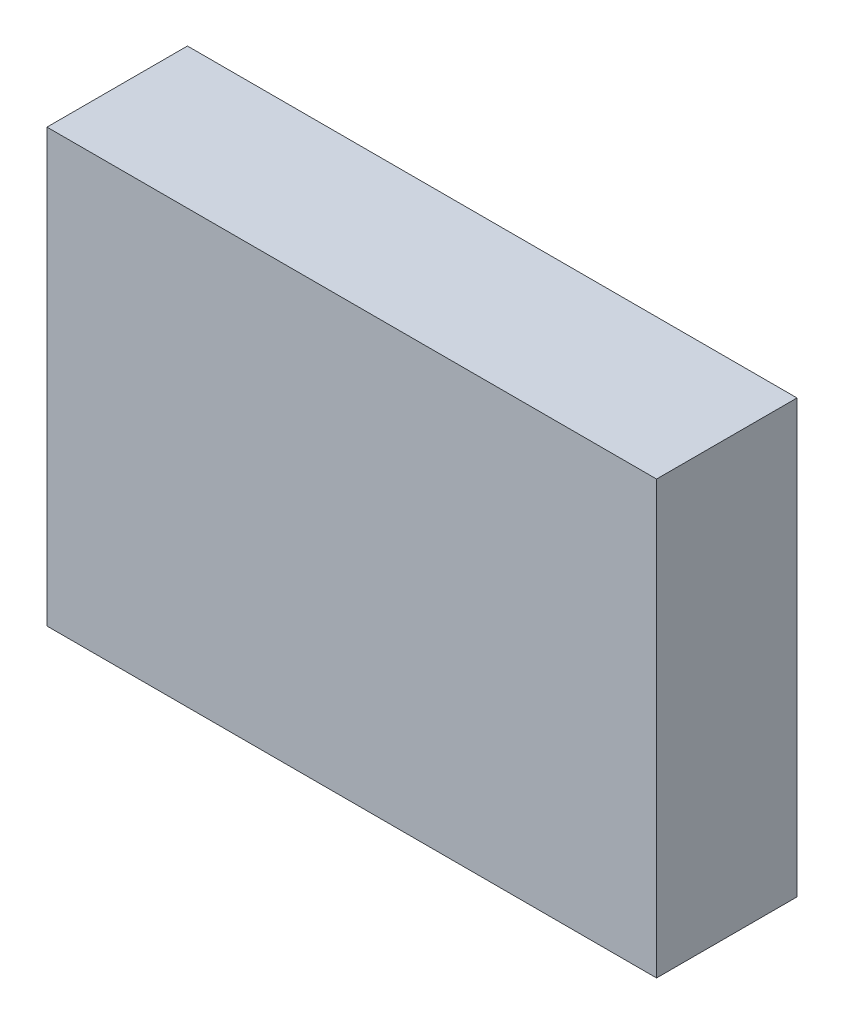
ISO-10303-21;
HEADER;
FILE_DESCRIPTION(('STEP AP214'),'2;1');
FILE_NAME('part.step','',(''),(''),'','','');
FILE_SCHEMA(('AUTOMOTIVE_DESIGN { 1 0 10303 214 1 1 1 1 }'));
ENDSEC;
DATA;
#1=APPLICATION_CONTEXT('core data for automotive mechanical design processes');
#2=APPLICATION_PROTOCOL_DEFINITION('international standard','automotive_design',2000,#1);
#3=PRODUCT_CONTEXT('',#1,'mechanical');
#4=PRODUCT('Part','Part','',(#3));
#5=PRODUCT_RELATED_PRODUCT_CATEGORY('part','',(#4));
#6=PRODUCT_DEFINITION_FORMATION('','',#4);
#7=PRODUCT_DEFINITION_CONTEXT('part definition',#1,'design');
#8=PRODUCT_DEFINITION('design','',#6,#7);
#9=PRODUCT_DEFINITION_SHAPE('','',#8);
#10=(LENGTH_UNIT() NAMED_UNIT(*) SI_UNIT(.MILLI.,.METRE.));
#11=(NAMED_UNIT(*) PLANE_ANGLE_UNIT() SI_UNIT($,.RADIAN.));
#12=(NAMED_UNIT(*) SI_UNIT($,.STERADIAN.) SOLID_ANGLE_UNIT());
#13=UNCERTAINTY_MEASURE_WITH_UNIT(LENGTH_MEASURE(1.E-05),#10,'distance_accuracy_value','');
#14=(GEOMETRIC_REPRESENTATION_CONTEXT(3) GLOBAL_UNCERTAINTY_ASSIGNED_CONTEXT((#13)) GLOBAL_UNIT_ASSIGNED_CONTEXT((#10,
#11,#12)) REPRESENTATION_CONTEXT('',''));
#15=CARTESIAN_POINT('',(0.,0.,0.));
#16=DIRECTION('',(0.,0.,1.));
#17=DIRECTION('',(1.,0.,0.));
#18=AXIS2_PLACEMENT_3D('',#15,#16,#17);
#19=CARTESIAN_POINT('',(55.1185201664401,-39.0725036048284,-25.4));
#20=DIRECTION('',(1.,0.,0.));
#21=DIRECTION('',(0.,0.,-1.));
#22=AXIS2_PLACEMENT_3D('',#19,#20,#21);
#23=PLANE('',#22);
#24=DIRECTION('',(0.,1.,0.));
#25=VECTOR('',#24,1.);
#26=CARTESIAN_POINT('',(55.1185201664401,-39.0725036048284,0.));
#27=LINE('',#26,#25);
#28=CARTESIAN_POINT('',(55.1185201664401,-39.0725036048284,0.));
#29=VERTEX_POINT('',#28);
#30=CARTESIAN_POINT('',(55.1185201664401,39.0725036048284,0.));
#31=VERTEX_POINT('',#30);
#32=EDGE_CURVE('E115',#29,#31,#27,.T.);
#33=ORIENTED_EDGE('',*,*,#32,.F.);
#34=DIRECTION('',(0.,0.,1.));
#35=VECTOR('',#34,1.);
#36=CARTESIAN_POINT('',(55.1185201664401,-39.0725036048284,-25.4));
#37=LINE('',#36,#35);
#38=CARTESIAN_POINT('',(55.1185201664401,-39.0725036048284,-25.4));
#39=VERTEX_POINT('',#38);
#40=EDGE_CURVE('E11',#39,#29,#37,.T.);
#41=ORIENTED_EDGE('',*,*,#40,.F.);
#42=DIRECTION('',(0.,1.,0.));
#43=VECTOR('',#42,1.);
#44=CARTESIAN_POINT('',(55.1185201664401,-39.0725036048284,-25.4));
#45=LINE('',#44,#43);
#46=CARTESIAN_POINT('',(55.1185201664401,39.0725036048284,-25.4));
#47=VERTEX_POINT('',#46);
#48=EDGE_CURVE('E107',#39,#47,#45,.T.);
#49=ORIENTED_EDGE('',*,*,#48,.T.);
#50=DIRECTION('',(0.,0.,1.));
#51=VECTOR('',#50,1.);
#52=CARTESIAN_POINT('',(55.1185201664401,39.0725036048284,-25.4));
#53=LINE('',#52,#51);
#54=EDGE_CURVE('E48',#47,#31,#53,.T.);
#55=ORIENTED_EDGE('',*,*,#54,.T.);
#56=EDGE_LOOP('',(#33,#41,#49,#55));
#57=FACE_BOUND('',#56,.T.);
#58=ADVANCED_FACE('F45',(#57),#23,.T.);
#59=CARTESIAN_POINT('',(-55.1185201664401,-39.0725036048284,-25.4));
#60=DIRECTION('',(0.,-1.,0.));
#61=DIRECTION('',(0.,0.,-1.));
#62=AXIS2_PLACEMENT_3D('',#59,#60,#61);
#63=PLANE('',#62);
#64=DIRECTION('',(1.,0.,0.));
#65=VECTOR('',#64,1.);
#66=CARTESIAN_POINT('',(-55.1185201664401,-39.0725036048284,0.));
#67=LINE('',#66,#65);
#68=CARTESIAN_POINT('',(-55.1185201664401,-39.0725036048284,0.));
#69=VERTEX_POINT('',#68);
#70=EDGE_CURVE('E110',#69,#29,#67,.T.);
#71=ORIENTED_EDGE('',*,*,#70,.F.);
#72=DIRECTION('',(0.,0.,1.));
#73=VECTOR('',#72,1.);
#74=CARTESIAN_POINT('',(-55.1185201664401,-39.0725036048284,-25.4));
#75=LINE('',#74,#73);
#76=CARTESIAN_POINT('',(-55.1185201664401,-39.0725036048284,-25.4));
#77=VERTEX_POINT('',#76);
#78=EDGE_CURVE('E55',#77,#69,#75,.T.);
#79=ORIENTED_EDGE('',*,*,#78,.F.);
#80=DIRECTION('',(1.,0.,0.));
#81=VECTOR('',#80,1.);
#82=CARTESIAN_POINT('',(-55.1185201664401,-39.0725036048284,-25.4));
#83=LINE('',#82,#81);
#84=EDGE_CURVE('E102',#77,#39,#83,.T.);
#85=ORIENTED_EDGE('',*,*,#84,.T.);
#86=ORIENTED_EDGE('',*,*,#40,.T.);
#87=EDGE_LOOP('',(#71,#79,#85,#86));
#88=FACE_BOUND('',#87,.T.);
#89=ADVANCED_FACE('F131',(#88),#63,.T.);
#90=CARTESIAN_POINT('',(-55.1185201664401,-39.0725036048284,-25.4));
#91=DIRECTION('',(-1.,0.,0.));
#92=DIRECTION('',(0.,0.,1.));
#93=AXIS2_PLACEMENT_3D('',#90,#91,#92);
#94=PLANE('',#93);
#95=DIRECTION('',(0.,-1.,0.));
#96=VECTOR('',#95,1.);
#97=CARTESIAN_POINT('',(-55.1185201664401,-39.0725036048284,0.));
#98=LINE('',#97,#96);
#99=CARTESIAN_POINT('',(-55.1185201664401,39.0725036048284,0.));
#100=VERTEX_POINT('',#99);
#101=EDGE_CURVE('E96',#100,#69,#98,.T.);
#102=ORIENTED_EDGE('',*,*,#101,.F.);
#103=DIRECTION('',(0.,0.,1.));
#104=VECTOR('',#103,1.);
#105=CARTESIAN_POINT('',(-55.1185201664401,39.0725036048284,-25.4));
#106=LINE('',#105,#104);
#107=CARTESIAN_POINT('',(-55.1185201664401,39.0725036048284,-25.4));
#108=VERTEX_POINT('',#107);
#109=EDGE_CURVE('E91',#108,#100,#106,.T.);
#110=ORIENTED_EDGE('',*,*,#109,.F.);
#111=DIRECTION('',(0.,-1.,0.));
#112=VECTOR('',#111,1.);
#113=CARTESIAN_POINT('',(-55.1185201664401,-39.0725036048284,-25.4));
#114=LINE('',#113,#112);
#115=EDGE_CURVE('E94',#108,#77,#114,.T.);
#116=ORIENTED_EDGE('',*,*,#115,.T.);
#117=ORIENTED_EDGE('',*,*,#78,.T.);
#118=EDGE_LOOP('',(#102,#110,#116,#117));
#119=FACE_BOUND('',#118,.T.);
#120=ADVANCED_FACE('F93',(#119),#94,.T.);
#121=CARTESIAN_POINT('',(-55.1185201664401,39.0725036048284,-25.4));
#122=DIRECTION('',(0.,1.,0.));
#123=DIRECTION('',(0.,0.,1.));
#124=AXIS2_PLACEMENT_3D('',#121,#122,#123);
#125=PLANE('',#124);
#126=DIRECTION('',(-1.,0.,0.));
#127=VECTOR('',#126,1.);
#128=CARTESIAN_POINT('',(-55.1185201664401,39.0725036048284,0.));
#129=LINE('',#128,#127);
#130=EDGE_CURVE('E119',#31,#100,#129,.T.);
#131=ORIENTED_EDGE('',*,*,#130,.F.);
#132=ORIENTED_EDGE('',*,*,#54,.F.);
#133=DIRECTION('',(-1.,0.,0.));
#134=VECTOR('',#133,1.);
#135=CARTESIAN_POINT('',(-55.1185201664401,39.0725036048284,-25.4));
#136=LINE('',#135,#134);
#137=EDGE_CURVE('E101',#47,#108,#136,.T.);
#138=ORIENTED_EDGE('',*,*,#137,.T.);
#139=ORIENTED_EDGE('',*,*,#109,.T.);
#140=EDGE_LOOP('',(#131,#132,#138,#139));
#141=FACE_BOUND('',#140,.T.);
#142=ADVANCED_FACE('F105',(#141),#125,.T.);
#143=CARTESIAN_POINT('',(0.,0.,-25.4));
#144=DIRECTION('',(0.,0.,-1.));
#145=DIRECTION('',(-1.,0.,0.));
#146=AXIS2_PLACEMENT_3D('',#143,#144,#145);
#147=PLANE('',#146);
#148=ORIENTED_EDGE('',*,*,#48,.F.);
#149=ORIENTED_EDGE('',*,*,#84,.F.);
#150=ORIENTED_EDGE('',*,*,#115,.F.);
#151=ORIENTED_EDGE('',*,*,#137,.F.);
#152=EDGE_LOOP('',(#148,#149,#150,#151));
#153=FACE_BOUND('',#152,.T.);
#154=ADVANCED_FACE('F100',(#153),#147,.T.);
#155=CARTESIAN_POINT('',(0.,0.,0.));
#156=DIRECTION('',(0.,0.,-1.));
#157=DIRECTION('',(-1.,0.,0.));
#158=AXIS2_PLACEMENT_3D('',#155,#156,#157);
#159=PLANE('',#158);
#160=ORIENTED_EDGE('',*,*,#32,.T.);
#161=ORIENTED_EDGE('',*,*,#130,.T.);
#162=ORIENTED_EDGE('',*,*,#101,.T.);
#163=ORIENTED_EDGE('',*,*,#70,.T.);
#164=EDGE_LOOP('',(#160,#161,#162,#163));
#165=FACE_BOUND('',#164,.T.);
#166=ADVANCED_FACE('F130',(#165),#159,.F.);
#167=CLOSED_SHELL('',(#58,#89,#120,#142,#154,#166));
#168=MANIFOLD_SOLID_BREP('B2',#167);
#169=ADVANCED_BREP_SHAPE_REPRESENTATION('',(#18,#168),#14);
#170=SHAPE_DEFINITION_REPRESENTATION(#9,#169);
ENDSEC;
END-ISO-10303-21;
